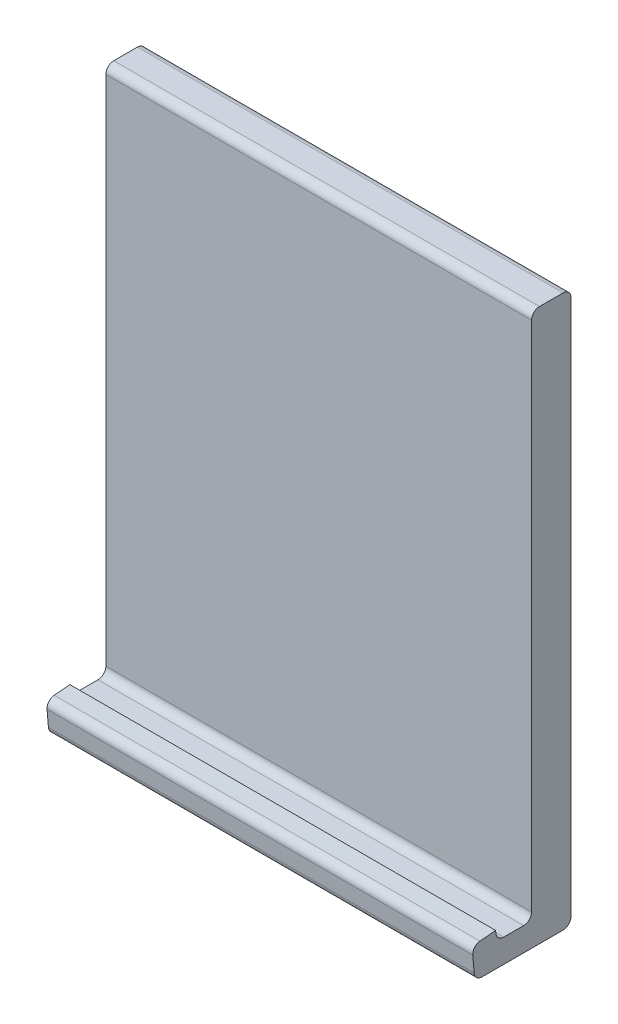
ISO-10303-21;
HEADER;
FILE_DESCRIPTION(('STEP AP214'),'2;1');
FILE_NAME('part.step','',(''),(''),'','','');
FILE_SCHEMA(('AUTOMOTIVE_DESIGN { 1 0 10303 214 1 1 1 1 }'));
ENDSEC;
DATA;
#1=APPLICATION_CONTEXT('core data for automotive mechanical design processes');
#2=APPLICATION_PROTOCOL_DEFINITION('international standard','automotive_design',2000,#1);
#3=PRODUCT_CONTEXT('',#1,'mechanical');
#4=PRODUCT('Part','Part','',(#3));
#5=PRODUCT_RELATED_PRODUCT_CATEGORY('part','',(#4));
#6=PRODUCT_DEFINITION_FORMATION('','',#4);
#7=PRODUCT_DEFINITION_CONTEXT('part definition',#1,'design');
#8=PRODUCT_DEFINITION('design','',#6,#7);
#9=PRODUCT_DEFINITION_SHAPE('','',#8);
#10=(LENGTH_UNIT() NAMED_UNIT(*) SI_UNIT(.MILLI.,.METRE.));
#11=(NAMED_UNIT(*) PLANE_ANGLE_UNIT() SI_UNIT($,.RADIAN.));
#12=(NAMED_UNIT(*) SI_UNIT($,.STERADIAN.) SOLID_ANGLE_UNIT());
#13=UNCERTAINTY_MEASURE_WITH_UNIT(LENGTH_MEASURE(1.E-05),#10,'distance_accuracy_value','');
#14=(GEOMETRIC_REPRESENTATION_CONTEXT(3) GLOBAL_UNCERTAINTY_ASSIGNED_CONTEXT((#13)) GLOBAL_UNIT_ASSIGNED_CONTEXT((#10,
#11,#12)) REPRESENTATION_CONTEXT('',''));
#15=CARTESIAN_POINT('',(0.,0.,0.));
#16=DIRECTION('',(0.,0.,1.));
#17=DIRECTION('',(1.,0.,0.));
#18=AXIS2_PLACEMENT_3D('',#15,#16,#17);
#19=CARTESIAN_POINT('',(0.,0.,0.));
#20=DIRECTION('',(0.,0.,1.));
#21=DIRECTION('',(1.,0.,0.));
#22=AXIS2_PLACEMENT_3D('',#19,#20,#21);
#23=PLANE('',#22);
#24=DIRECTION('',(0.,-1.,0.));
#25=VECTOR('',#24,1.);
#26=CARTESIAN_POINT('',(0.,70.,0.));
#27=LINE('',#26,#25);
#28=CARTESIAN_POINT('',(0.,69.,0.));
#29=VERTEX_POINT('',#28);
#30=CARTESIAN_POINT('',(0.,3.99999999999998,0.));
#31=VERTEX_POINT('',#30);
#32=EDGE_CURVE('E168',#29,#31,#27,.T.);
#33=ORIENTED_EDGE('',*,*,#32,.T.);
#34=DIRECTION('',(1.,0.,0.));
#35=VECTOR('',#34,1.);
#36=CARTESIAN_POINT('',(0.,3.99999999999998,0.));
#37=LINE('',#36,#35);
#38=CARTESIAN_POINT('',(54.,3.99999999999998,0.));
#39=VERTEX_POINT('',#38);
#40=EDGE_CURVE('E258',#31,#39,#37,.T.);
#41=ORIENTED_EDGE('',*,*,#40,.T.);
#42=DIRECTION('',(0.,1.,0.));
#43=VECTOR('',#42,1.);
#44=CARTESIAN_POINT('',(54.,70.,0.));
#45=LINE('',#44,#43);
#46=CARTESIAN_POINT('',(54.,69.,0.));
#47=VERTEX_POINT('',#46);
#48=EDGE_CURVE('E174',#39,#47,#45,.T.);
#49=ORIENTED_EDGE('',*,*,#48,.T.);
#50=DIRECTION('',(-1.,0.,0.));
#51=VECTOR('',#50,1.);
#52=CARTESIAN_POINT('',(0.,69.,0.));
#53=LINE('',#52,#51);
#54=EDGE_CURVE('E254',#47,#29,#53,.T.);
#55=ORIENTED_EDGE('',*,*,#54,.T.);
#56=EDGE_LOOP('',(#33,#41,#49,#55));
#57=FACE_BOUND('',#56,.T.);
#58=ADVANCED_FACE('F39',(#57),#23,.T.);
#59=CARTESIAN_POINT('',(0.,70.,-5.));
#60=DIRECTION('',(-1.,0.,0.));
#61=DIRECTION('',(0.,-1.,0.));
#62=AXIS2_PLACEMENT_3D('',#59,#60,#61);
#63=PLANE('',#62);
#64=DIRECTION('',(0.,0.,1.));
#65=VECTOR('',#64,1.);
#66=CARTESIAN_POINT('',(0.,0.,-5.));
#67=LINE('',#66,#65);
#68=CARTESIAN_POINT('',(0.,0.,-4.));
#69=VERTEX_POINT('',#68);
#70=CARTESIAN_POINT('',(0.,0.,6.28366882598258));
#71=VERTEX_POINT('',#70);
#72=EDGE_CURVE('E187',#69,#71,#67,.T.);
#73=ORIENTED_EDGE('',*,*,#72,.T.);
#74=CARTESIAN_POINT('',(0.,1.,6.28366882598258));
#75=DIRECTION('',(-1.,0.,0.));
#76=DIRECTION('',(0.,-1.,0.));
#77=AXIS2_PLACEMENT_3D('',#74,#75,#76);
#78=CIRCLE('',#77,1.);
#79=CARTESIAN_POINT('',(0.,0.912844257252342,7.27986352407433));
#80=VERTEX_POINT('',#79);
#81=EDGE_CURVE('E227',#71,#80,#78,.T.);
#82=ORIENTED_EDGE('',*,*,#81,.T.);
#83=DIRECTION('',(0.,0.996194698091746,0.0871557427476583));
#84=VECTOR('',#83,1.);
#85=CARTESIAN_POINT('',(0.,0.,7.2));
#86=LINE('',#85,#84);
#87=CARTESIAN_POINT('',(0.,2.98858409427517,7.46146722824297));
#88=VERTEX_POINT('',#87);
#89=EDGE_CURVE('E302',#80,#88,#86,.T.);
#90=ORIENTED_EDGE('',*,*,#89,.T.);
#91=CARTESIAN_POINT('',(0.,3.07573983702283,6.46527253015123));
#92=DIRECTION('',(-1.,0.,0.));
#93=DIRECTION('',(0.,-1.,0.));
#94=AXIS2_PLACEMENT_3D('',#91,#92,#93);
#95=CIRCLE('',#94,1.);
#96=CARTESIAN_POINT('',(0.,4.07193453511457,6.55242827289888));
#97=VERTEX_POINT('',#96);
#98=EDGE_CURVE('E224',#88,#97,#95,.T.);
#99=ORIENTED_EDGE('',*,*,#98,.T.);
#100=DIRECTION('',(0.,-0.0871557427476584,0.996194698091746));
#101=VECTOR('',#100,1.);
#102=CARTESIAN_POINT('',(0.,4.24624602060989,4.56003887671539));
#103=LINE('',#102,#101);
#104=CARTESIAN_POINT('',(0.,4.24624602060989,4.56003887671539));
#105=VERTEX_POINT('',#104);
#106=EDGE_CURVE('E360',#105,#97,#103,.T.);
#107=ORIENTED_EDGE('',*,*,#106,.F.);
#108=DIRECTION('',(0.,0.996194698091746,0.0871557427476587));
#109=VECTOR('',#108,1.);
#110=CARTESIAN_POINT('',(0.,2.99999999999996,4.45100647794773));
#111=LINE('',#110,#109);
#112=CARTESIAN_POINT('',(0.,3.91284425725231,4.53087000202205));
#113=VERTEX_POINT('',#112);
#114=EDGE_CURVE('E165',#113,#105,#111,.T.);
#115=ORIENTED_EDGE('',*,*,#114,.F.);
#116=CARTESIAN_POINT('',(0.,3.99999999999997,3.53467530393031));
#117=DIRECTION('',(-1.,0.,0.));
#118=DIRECTION('',(0.,-1.,0.));
#119=AXIS2_PLACEMENT_3D('',#116,#117,#118);
#120=CIRCLE('',#119,1.);
#121=CARTESIAN_POINT('',(0.,2.99999999999997,3.5346753039303));
#122=VERTEX_POINT('',#121);
#123=EDGE_CURVE('E48',#113,#122,#120,.F.);
#124=ORIENTED_EDGE('',*,*,#123,.T.);
#125=DIRECTION('',(0.,0.,1.));
#126=VECTOR('',#125,1.);
#127=CARTESIAN_POINT('',(0.,3.,-5.));
#128=LINE('',#127,#126);
#129=CARTESIAN_POINT('',(0.,2.99999999999998,0.999999999999997));
#130=VERTEX_POINT('',#129);
#131=EDGE_CURVE('E155',#130,#122,#128,.T.);
#132=ORIENTED_EDGE('',*,*,#131,.F.);
#133=CARTESIAN_POINT('',(0.,3.99999999999998,1.));
#134=DIRECTION('',(-1.,0.,0.));
#135=DIRECTION('',(0.,-1.,0.));
#136=AXIS2_PLACEMENT_3D('',#133,#134,#135);
#137=CIRCLE('',#136,1.);
#138=EDGE_CURVE('E287',#130,#31,#137,.F.);
#139=ORIENTED_EDGE('',*,*,#138,.T.);
#140=ORIENTED_EDGE('',*,*,#32,.F.);
#141=CARTESIAN_POINT('',(0.,69.,-1.));
#142=DIRECTION('',(-1.,0.,0.));
#143=DIRECTION('',(0.,-1.,0.));
#144=AXIS2_PLACEMENT_3D('',#141,#142,#143);
#145=CIRCLE('',#144,1.);
#146=CARTESIAN_POINT('',(0.,70.,-1.));
#147=VERTEX_POINT('',#146);
#148=EDGE_CURVE('E218',#29,#147,#145,.T.);
#149=ORIENTED_EDGE('',*,*,#148,.T.);
#150=DIRECTION('',(0.,0.,1.));
#151=VECTOR('',#150,1.);
#152=CARTESIAN_POINT('',(0.,70.,-5.));
#153=LINE('',#152,#151);
#154=CARTESIAN_POINT('',(0.,70.,-4.));
#155=VERTEX_POINT('',#154);
#156=EDGE_CURVE('E192',#155,#147,#153,.T.);
#157=ORIENTED_EDGE('',*,*,#156,.F.);
#158=CARTESIAN_POINT('',(0.,69.,-4.));
#159=DIRECTION('',(-1.,0.,0.));
#160=DIRECTION('',(0.,-1.,0.));
#161=AXIS2_PLACEMENT_3D('',#158,#159,#160);
#162=CIRCLE('',#161,1.);
#163=CARTESIAN_POINT('',(0.,69.,-5.));
#164=VERTEX_POINT('',#163);
#165=EDGE_CURVE('E215',#155,#164,#162,.T.);
#166=ORIENTED_EDGE('',*,*,#165,.T.);
#167=DIRECTION('',(0.,-1.,0.));
#168=VECTOR('',#167,1.);
#169=CARTESIAN_POINT('',(0.,70.,-5.));
#170=LINE('',#169,#168);
#171=CARTESIAN_POINT('',(0.,1.,-5.));
#172=VERTEX_POINT('',#171);
#173=EDGE_CURVE('E180',#164,#172,#170,.T.);
#174=ORIENTED_EDGE('',*,*,#173,.T.);
#175=CARTESIAN_POINT('',(0.,1.,-4.));
#176=DIRECTION('',(-1.,0.,0.));
#177=DIRECTION('',(0.,-1.,0.));
#178=AXIS2_PLACEMENT_3D('',#175,#176,#177);
#179=CIRCLE('',#178,1.);
#180=EDGE_CURVE('E221',#172,#69,#179,.T.);
#181=ORIENTED_EDGE('',*,*,#180,.T.);
#182=EDGE_LOOP('',(#73,#82,#90,#99,#107,#115,#124,#132,#139,#140,#149,#157,#166,#174,#181));
#183=FACE_BOUND('',#182,.T.);
#184=ADVANCED_FACE('F293',(#183),#63,.T.);
#185=CARTESIAN_POINT('',(0.,70.,-5.));
#186=DIRECTION('',(0.,1.,0.));
#187=DIRECTION('',(0.,0.,1.));
#188=AXIS2_PLACEMENT_3D('',#185,#186,#187);
#189=PLANE('',#188);
#190=ORIENTED_EDGE('',*,*,#156,.T.);
#191=DIRECTION('',(-1.,0.,0.));
#192=VECTOR('',#191,1.);
#193=CARTESIAN_POINT('',(0.,70.,-1.));
#194=LINE('',#193,#192);
#195=CARTESIAN_POINT('',(54.,70.,-1.));
#196=VERTEX_POINT('',#195);
#197=EDGE_CURVE('E281',#147,#196,#194,.F.);
#198=ORIENTED_EDGE('',*,*,#197,.T.);
#199=DIRECTION('',(0.,0.,1.));
#200=VECTOR('',#199,1.);
#201=CARTESIAN_POINT('',(54.,70.,-5.));
#202=LINE('',#201,#200);
#203=CARTESIAN_POINT('',(54.,70.,-4.));
#204=VERTEX_POINT('',#203);
#205=EDGE_CURVE('E197',#204,#196,#202,.T.);
#206=ORIENTED_EDGE('',*,*,#205,.F.);
#207=DIRECTION('',(-1.,0.,0.));
#208=VECTOR('',#207,1.);
#209=CARTESIAN_POINT('',(0.,70.,-4.));
#210=LINE('',#209,#208);
#211=EDGE_CURVE('E277',#204,#155,#210,.T.);
#212=ORIENTED_EDGE('',*,*,#211,.T.);
#213=EDGE_LOOP('',(#190,#198,#206,#212));
#214=FACE_BOUND('',#213,.T.);
#215=ADVANCED_FACE('F324',(#214),#189,.T.);
#216=CARTESIAN_POINT('',(54.,70.,-5.));
#217=DIRECTION('',(1.,0.,0.));
#218=DIRECTION('',(0.,1.,0.));
#219=AXIS2_PLACEMENT_3D('',#216,#217,#218);
#220=PLANE('',#219);
#221=DIRECTION('',(0.,0.996194698091746,0.0871557427476583));
#222=VECTOR('',#221,1.);
#223=CARTESIAN_POINT('',(54.,0.,7.2));
#224=LINE('',#223,#222);
#225=CARTESIAN_POINT('',(54.,0.912844257252342,7.27986352407433));
#226=VERTEX_POINT('',#225);
#227=CARTESIAN_POINT('',(54.,2.98858409427517,7.46146722824297));
#228=VERTEX_POINT('',#227);
#229=EDGE_CURVE('E161',#226,#228,#224,.T.);
#230=ORIENTED_EDGE('',*,*,#229,.F.);
#231=CARTESIAN_POINT('',(54.,1.,6.28366882598258));
#232=DIRECTION('',(1.,0.,0.));
#233=DIRECTION('',(0.,1.,0.));
#234=AXIS2_PLACEMENT_3D('',#231,#232,#233);
#235=CIRCLE('',#234,1.);
#236=CARTESIAN_POINT('',(54.,0.,6.28366882598258));
#237=VERTEX_POINT('',#236);
#238=EDGE_CURVE('E249',#226,#237,#235,.T.);
#239=ORIENTED_EDGE('',*,*,#238,.T.);
#240=DIRECTION('',(0.,0.,1.));
#241=VECTOR('',#240,1.);
#242=CARTESIAN_POINT('',(54.,0.,-5.));
#243=LINE('',#242,#241);
#244=CARTESIAN_POINT('',(54.,0.,-4.));
#245=VERTEX_POINT('',#244);
#246=EDGE_CURVE('E201',#245,#237,#243,.T.);
#247=ORIENTED_EDGE('',*,*,#246,.F.);
#248=CARTESIAN_POINT('',(54.,1.,-4.));
#249=DIRECTION('',(1.,0.,0.));
#250=DIRECTION('',(0.,1.,0.));
#251=AXIS2_PLACEMENT_3D('',#248,#249,#250);
#252=CIRCLE('',#251,1.);
#253=CARTESIAN_POINT('',(54.,1.,-5.));
#254=VERTEX_POINT('',#253);
#255=EDGE_CURVE('E243',#245,#254,#252,.T.);
#256=ORIENTED_EDGE('',*,*,#255,.T.);
#257=DIRECTION('',(0.,1.,0.));
#258=VECTOR('',#257,1.);
#259=CARTESIAN_POINT('',(54.,70.,-5.));
#260=LINE('',#259,#258);
#261=CARTESIAN_POINT('',(54.,69.,-5.));
#262=VERTEX_POINT('',#261);
#263=EDGE_CURVE('E184',#254,#262,#260,.T.);
#264=ORIENTED_EDGE('',*,*,#263,.T.);
#265=CARTESIAN_POINT('',(54.,69.,-4.));
#266=DIRECTION('',(1.,0.,0.));
#267=DIRECTION('',(0.,1.,0.));
#268=AXIS2_PLACEMENT_3D('',#265,#266,#267);
#269=CIRCLE('',#268,1.);
#270=EDGE_CURVE('E237',#262,#204,#269,.T.);
#271=ORIENTED_EDGE('',*,*,#270,.T.);
#272=ORIENTED_EDGE('',*,*,#205,.T.);
#273=CARTESIAN_POINT('',(54.,69.,-1.));
#274=DIRECTION('',(1.,0.,0.));
#275=DIRECTION('',(0.,1.,0.));
#276=AXIS2_PLACEMENT_3D('',#273,#274,#275);
#277=CIRCLE('',#276,1.);
#278=EDGE_CURVE('E240',#196,#47,#277,.T.);
#279=ORIENTED_EDGE('',*,*,#278,.T.);
#280=ORIENTED_EDGE('',*,*,#48,.F.);
#281=CARTESIAN_POINT('',(54.,3.99999999999998,1.));
#282=DIRECTION('',(1.,0.,0.));
#283=DIRECTION('',(0.,1.,0.));
#284=AXIS2_PLACEMENT_3D('',#281,#282,#283);
#285=CIRCLE('',#284,1.);
#286=CARTESIAN_POINT('',(54.,2.99999999999998,0.999999999999997));
#287=VERTEX_POINT('',#286);
#288=EDGE_CURVE('E284',#39,#287,#285,.F.);
#289=ORIENTED_EDGE('',*,*,#288,.T.);
#290=DIRECTION('',(0.,0.,1.));
#291=VECTOR('',#290,1.);
#292=CARTESIAN_POINT('',(54.,3.,-5.));
#293=LINE('',#292,#291);
#294=CARTESIAN_POINT('',(54.,2.99999999999997,3.5346753039303));
#295=VERTEX_POINT('',#294);
#296=EDGE_CURVE('E169',#287,#295,#293,.T.);
#297=ORIENTED_EDGE('',*,*,#296,.T.);
#298=CARTESIAN_POINT('',(54.,3.99999999999997,3.53467530393031));
#299=DIRECTION('',(1.,0.,0.));
#300=DIRECTION('',(0.,1.,0.));
#301=AXIS2_PLACEMENT_3D('',#298,#299,#300);
#302=CIRCLE('',#301,1.);
#303=CARTESIAN_POINT('',(54.,3.91284425725231,4.53087000202205));
#304=VERTEX_POINT('',#303);
#305=EDGE_CURVE('E11',#295,#304,#302,.F.);
#306=ORIENTED_EDGE('',*,*,#305,.T.);
#307=DIRECTION('',(0.,0.996194698091746,0.0871557427476587));
#308=VECTOR('',#307,1.);
#309=CARTESIAN_POINT('',(54.,2.99999999999996,4.45100647794773));
#310=LINE('',#309,#308);
#311=CARTESIAN_POINT('',(54.,4.24624602060989,4.56003887671539));
#312=VERTEX_POINT('',#311);
#313=EDGE_CURVE('E145',#304,#312,#310,.T.);
#314=ORIENTED_EDGE('',*,*,#313,.T.);
#315=DIRECTION('',(0.,-0.0871557427476584,0.996194698091746));
#316=VECTOR('',#315,1.);
#317=CARTESIAN_POINT('',(54.,4.24624602060989,4.56003887671539));
#318=LINE('',#317,#316);
#319=CARTESIAN_POINT('',(54.,4.07193453511457,6.55242827289888));
#320=VERTEX_POINT('',#319);
#321=EDGE_CURVE('E148',#312,#320,#318,.T.);
#322=ORIENTED_EDGE('',*,*,#321,.T.);
#323=CARTESIAN_POINT('',(54.,3.07573983702283,6.46527253015123));
#324=DIRECTION('',(1.,0.,0.));
#325=DIRECTION('',(0.,1.,0.));
#326=AXIS2_PLACEMENT_3D('',#323,#324,#325);
#327=CIRCLE('',#326,1.);
#328=EDGE_CURVE('E246',#320,#228,#327,.T.);
#329=ORIENTED_EDGE('',*,*,#328,.T.);
#330=EDGE_LOOP('',(#230,#239,#247,#256,#264,#271,#272,#279,#280,#289,#297,#306,#314,#322,#329));
#331=FACE_BOUND('',#330,.T.);
#332=ADVANCED_FACE('F147',(#331),#220,.T.);
#333=CARTESIAN_POINT('',(0.,0.,-5.));
#334=DIRECTION('',(0.,-1.,0.));
#335=DIRECTION('',(0.,0.,-1.));
#336=AXIS2_PLACEMENT_3D('',#333,#334,#335);
#337=PLANE('',#336);
#338=ORIENTED_EDGE('',*,*,#246,.T.);
#339=DIRECTION('',(-1.,0.,0.));
#340=VECTOR('',#339,1.);
#341=CARTESIAN_POINT('',(0.,0.,6.28366882598258));
#342=LINE('',#341,#340);
#343=EDGE_CURVE('E211',#237,#71,#342,.T.);
#344=ORIENTED_EDGE('',*,*,#343,.T.);
#345=ORIENTED_EDGE('',*,*,#72,.F.);
#346=DIRECTION('',(1.,0.,0.));
#347=VECTOR('',#346,1.);
#348=CARTESIAN_POINT('',(54.,0.,-4.));
#349=LINE('',#348,#347);
#350=EDGE_CURVE('E196',#69,#245,#349,.T.);
#351=ORIENTED_EDGE('',*,*,#350,.T.);
#352=EDGE_LOOP('',(#338,#344,#345,#351));
#353=FACE_BOUND('',#352,.T.);
#354=ADVANCED_FACE('F335',(#353),#337,.T.);
#355=CARTESIAN_POINT('',(0.,0.,-5.));
#356=DIRECTION('',(0.,0.,1.));
#357=DIRECTION('',(1.,0.,0.));
#358=AXIS2_PLACEMENT_3D('',#355,#356,#357);
#359=PLANE('',#358);
#360=ORIENTED_EDGE('',*,*,#263,.F.);
#361=DIRECTION('',(1.,0.,0.));
#362=VECTOR('',#361,1.);
#363=CARTESIAN_POINT('',(0.,1.,-5.));
#364=LINE('',#363,#362);
#365=EDGE_CURVE('E274',#254,#172,#364,.F.);
#366=ORIENTED_EDGE('',*,*,#365,.T.);
#367=ORIENTED_EDGE('',*,*,#173,.F.);
#368=DIRECTION('',(-1.,0.,0.));
#369=VECTOR('',#368,1.);
#370=CARTESIAN_POINT('',(54.,69.,-5.));
#371=LINE('',#370,#369);
#372=EDGE_CURVE('E271',#164,#262,#371,.F.);
#373=ORIENTED_EDGE('',*,*,#372,.T.);
#374=EDGE_LOOP('',(#360,#366,#367,#373));
#375=FACE_BOUND('',#374,.T.);
#376=ADVANCED_FACE('F328',(#375),#359,.F.);
#377=CARTESIAN_POINT('',(54.,2.99999999999996,4.45100647794773));
#378=DIRECTION('',(0.,-0.0871557427476587,0.996194698091746));
#379=DIRECTION('',(0.,-0.996194698091746,-0.0871557427476587));
#380=AXIS2_PLACEMENT_3D('',#377,#378,#379);
#381=PLANE('',#380);
#382=ORIENTED_EDGE('',*,*,#313,.F.);
#383=DIRECTION('',(-1.,0.,0.));
#384=VECTOR('',#383,1.);
#385=CARTESIAN_POINT('',(0.,3.91284425725231,4.53087000202205));
#386=LINE('',#385,#384);
#387=EDGE_CURVE('E268',#304,#113,#386,.T.);
#388=ORIENTED_EDGE('',*,*,#387,.T.);
#389=ORIENTED_EDGE('',*,*,#114,.T.);
#390=DIRECTION('',(-1.,0.,0.));
#391=VECTOR('',#390,1.);
#392=CARTESIAN_POINT('',(54.,4.24624602060989,4.56003887671539));
#393=LINE('',#392,#391);
#394=EDGE_CURVE('E159',#312,#105,#393,.T.);
#395=ORIENTED_EDGE('',*,*,#394,.F.);
#396=EDGE_LOOP('',(#382,#388,#389,#395));
#397=FACE_BOUND('',#396,.T.);
#398=ADVANCED_FACE('F163',(#397),#381,.F.);
#399=CARTESIAN_POINT('',(54.,4.24624602060989,4.56003887671539));
#400=DIRECTION('',(0.,-0.996194698091746,-0.0871557427476584));
#401=DIRECTION('',(0.,0.0871557427476584,-0.996194698091746));
#402=AXIS2_PLACEMENT_3D('',#399,#400,#401);
#403=PLANE('',#402);
#404=ORIENTED_EDGE('',*,*,#106,.T.);
#405=DIRECTION('',(-1.,0.,0.));
#406=VECTOR('',#405,1.);
#407=CARTESIAN_POINT('',(54.,4.07193453511457,6.55242827289888));
#408=LINE('',#407,#406);
#409=EDGE_CURVE('E55',#97,#320,#408,.F.);
#410=ORIENTED_EDGE('',*,*,#409,.T.);
#411=ORIENTED_EDGE('',*,*,#321,.F.);
#412=ORIENTED_EDGE('',*,*,#394,.T.);
#413=EDGE_LOOP('',(#404,#410,#411,#412));
#414=FACE_BOUND('',#413,.T.);
#415=ADVANCED_FACE('F158',(#414),#403,.F.);
#416=CARTESIAN_POINT('',(54.,0.,7.2));
#417=DIRECTION('',(0.,-0.0871557427476583,0.996194698091746));
#418=DIRECTION('',(0.,-0.996194698091746,-0.0871557427476583));
#419=AXIS2_PLACEMENT_3D('',#416,#417,#418);
#420=PLANE('',#419);
#421=ORIENTED_EDGE('',*,*,#89,.F.);
#422=DIRECTION('',(-1.,0.,0.));
#423=VECTOR('',#422,1.);
#424=CARTESIAN_POINT('',(54.,0.912844257252342,7.27986352407433));
#425=LINE('',#424,#423);
#426=EDGE_CURVE('E234',#80,#226,#425,.F.);
#427=ORIENTED_EDGE('',*,*,#426,.T.);
#428=ORIENTED_EDGE('',*,*,#229,.T.);
#429=DIRECTION('',(-1.,0.,0.));
#430=VECTOR('',#429,1.);
#431=CARTESIAN_POINT('',(0.,2.98858409427517,7.46146722824297));
#432=LINE('',#431,#430);
#433=EDGE_CURVE('E230',#228,#88,#432,.T.);
#434=ORIENTED_EDGE('',*,*,#433,.T.);
#435=EDGE_LOOP('',(#421,#427,#428,#434));
#436=FACE_BOUND('',#435,.T.);
#437=ADVANCED_FACE('F352',(#436),#420,.T.);
#438=CARTESIAN_POINT('',(54.,3.,-5.));
#439=DIRECTION('',(0.,-1.,0.));
#440=DIRECTION('',(0.,0.,-1.));
#441=AXIS2_PLACEMENT_3D('',#438,#439,#440);
#442=PLANE('',#441);
#443=ORIENTED_EDGE('',*,*,#296,.F.);
#444=DIRECTION('',(1.,0.,0.));
#445=VECTOR('',#444,1.);
#446=CARTESIAN_POINT('',(54.,2.99999999999998,0.999999999999997));
#447=LINE('',#446,#445);
#448=EDGE_CURVE('E265',#287,#130,#447,.F.);
#449=ORIENTED_EDGE('',*,*,#448,.T.);
#450=ORIENTED_EDGE('',*,*,#131,.T.);
#451=DIRECTION('',(-1.,0.,0.));
#452=VECTOR('',#451,1.);
#453=CARTESIAN_POINT('',(54.,2.99999999999997,3.5346753039303));
#454=LINE('',#453,#452);
#455=EDGE_CURVE('E262',#122,#295,#454,.F.);
#456=ORIENTED_EDGE('',*,*,#455,.T.);
#457=EDGE_LOOP('',(#443,#449,#450,#456));
#458=FACE_BOUND('',#457,.T.);
#459=ADVANCED_FACE('F299',(#458),#442,.F.);
#460=CARTESIAN_POINT('',(0.,1.,6.28366882598258));
#461=DIRECTION('',(-1.,0.,0.));
#462=DIRECTION('',(0.,0.,1.));
#463=AXIS2_PLACEMENT_3D('',#460,#461,#462);
#464=CYLINDRICAL_SURFACE('',#463,1.);
#465=ORIENTED_EDGE('',*,*,#238,.F.);
#466=ORIENTED_EDGE('',*,*,#426,.F.);
#467=ORIENTED_EDGE('',*,*,#81,.F.);
#468=ORIENTED_EDGE('',*,*,#343,.F.);
#469=EDGE_LOOP('',(#465,#466,#467,#468));
#470=FACE_BOUND('',#469,.T.);
#471=ADVANCED_FACE('F339',(#470),#464,.T.);
#472=CARTESIAN_POINT('',(54.,3.07573983702283,6.46527253015123));
#473=DIRECTION('',(1.,0.,0.));
#474=DIRECTION('',(0.,0.,-1.));
#475=AXIS2_PLACEMENT_3D('',#472,#473,#474);
#476=CYLINDRICAL_SURFACE('',#475,1.);
#477=ORIENTED_EDGE('',*,*,#328,.F.);
#478=ORIENTED_EDGE('',*,*,#409,.F.);
#479=ORIENTED_EDGE('',*,*,#98,.F.);
#480=ORIENTED_EDGE('',*,*,#433,.F.);
#481=EDGE_LOOP('',(#477,#478,#479,#480));
#482=FACE_BOUND('',#481,.T.);
#483=ADVANCED_FACE('F315',(#482),#476,.T.);
#484=CARTESIAN_POINT('',(0.,3.99999999999998,1.));
#485=DIRECTION('',(1.,0.,0.));
#486=DIRECTION('',(0.,0.,-1.));
#487=AXIS2_PLACEMENT_3D('',#484,#485,#486);
#488=CYLINDRICAL_SURFACE('',#487,1.);
#489=ORIENTED_EDGE('',*,*,#138,.F.);
#490=ORIENTED_EDGE('',*,*,#448,.F.);
#491=ORIENTED_EDGE('',*,*,#288,.F.);
#492=ORIENTED_EDGE('',*,*,#40,.F.);
#493=EDGE_LOOP('',(#489,#490,#491,#492));
#494=FACE_BOUND('',#493,.T.);
#495=ADVANCED_FACE('F306',(#494),#488,.F.);
#496=CARTESIAN_POINT('',(54.,3.99999999999997,3.53467530393031));
#497=DIRECTION('',(1.,0.,0.));
#498=DIRECTION('',(0.,0.,-1.));
#499=AXIS2_PLACEMENT_3D('',#496,#497,#498);
#500=CYLINDRICAL_SURFACE('',#499,1.);
#501=ORIENTED_EDGE('',*,*,#305,.F.);
#502=ORIENTED_EDGE('',*,*,#455,.F.);
#503=ORIENTED_EDGE('',*,*,#123,.F.);
#504=ORIENTED_EDGE('',*,*,#387,.F.);
#505=EDGE_LOOP('',(#501,#502,#503,#504));
#506=FACE_BOUND('',#505,.T.);
#507=ADVANCED_FACE('F303',(#506),#500,.F.);
#508=CARTESIAN_POINT('',(0.,1.,-4.));
#509=DIRECTION('',(-1.,0.,0.));
#510=DIRECTION('',(0.,0.,1.));
#511=AXIS2_PLACEMENT_3D('',#508,#509,#510);
#512=CYLINDRICAL_SURFACE('',#511,1.);
#513=ORIENTED_EDGE('',*,*,#180,.F.);
#514=ORIENTED_EDGE('',*,*,#365,.F.);
#515=ORIENTED_EDGE('',*,*,#255,.F.);
#516=ORIENTED_EDGE('',*,*,#350,.F.);
#517=EDGE_LOOP('',(#513,#514,#515,#516));
#518=FACE_BOUND('',#517,.T.);
#519=ADVANCED_FACE('F305',(#518),#512,.T.);
#520=CARTESIAN_POINT('',(0.,69.,-1.));
#521=DIRECTION('',(-1.,0.,0.));
#522=DIRECTION('',(0.,0.,1.));
#523=AXIS2_PLACEMENT_3D('',#520,#521,#522);
#524=CYLINDRICAL_SURFACE('',#523,1.);
#525=ORIENTED_EDGE('',*,*,#278,.F.);
#526=ORIENTED_EDGE('',*,*,#197,.F.);
#527=ORIENTED_EDGE('',*,*,#148,.F.);
#528=ORIENTED_EDGE('',*,*,#54,.F.);
#529=EDGE_LOOP('',(#525,#526,#527,#528));
#530=FACE_BOUND('',#529,.T.);
#531=ADVANCED_FACE('F312',(#530),#524,.T.);
#532=CARTESIAN_POINT('',(0.,69.,-4.));
#533=DIRECTION('',(1.,0.,0.));
#534=DIRECTION('',(0.,0.,-1.));
#535=AXIS2_PLACEMENT_3D('',#532,#533,#534);
#536=CYLINDRICAL_SURFACE('',#535,1.);
#537=ORIENTED_EDGE('',*,*,#270,.F.);
#538=ORIENTED_EDGE('',*,*,#372,.F.);
#539=ORIENTED_EDGE('',*,*,#165,.F.);
#540=ORIENTED_EDGE('',*,*,#211,.F.);
#541=EDGE_LOOP('',(#537,#538,#539,#540));
#542=FACE_BOUND('',#541,.T.);
#543=ADVANCED_FACE('F41',(#542),#536,.T.);
#544=CLOSED_SHELL('',(#58,#184,#215,#332,#354,#376,#398,#415,#437,#459,#471,#483,#495,#507,#519,
#531,#543));
#545=MANIFOLD_SOLID_BREP('B2',#544);
#546=ADVANCED_BREP_SHAPE_REPRESENTATION('',(#18,#545),#14);
#547=SHAPE_DEFINITION_REPRESENTATION(#9,#546);
ENDSEC;
END-ISO-10303-21;
